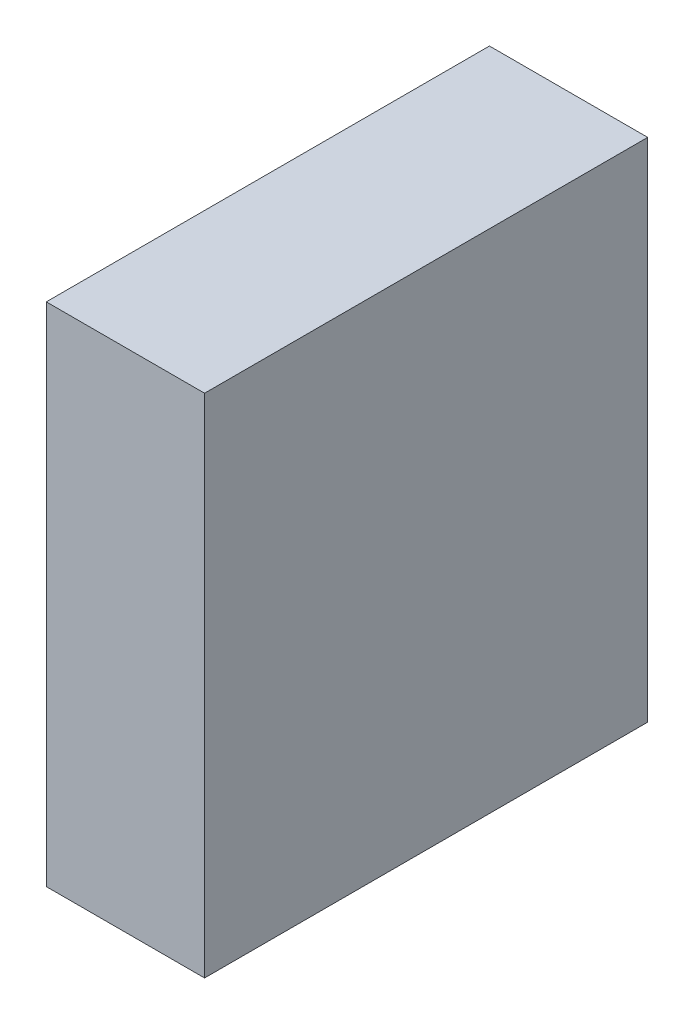
ISO-10303-21;
HEADER;
FILE_DESCRIPTION(('STEP AP214'),'2;1');
FILE_NAME('part.step','',(''),(''),'','','');
FILE_SCHEMA(('AUTOMOTIVE_DESIGN { 1 0 10303 214 1 1 1 1 }'));
ENDSEC;
DATA;
#1=APPLICATION_CONTEXT('core data for automotive mechanical design processes');
#2=APPLICATION_PROTOCOL_DEFINITION('international standard','automotive_design',2000,#1);
#3=PRODUCT_CONTEXT('',#1,'mechanical');
#4=PRODUCT('Part','Part','',(#3));
#5=PRODUCT_RELATED_PRODUCT_CATEGORY('part','',(#4));
#6=PRODUCT_DEFINITION_FORMATION('','',#4);
#7=PRODUCT_DEFINITION_CONTEXT('part definition',#1,'design');
#8=PRODUCT_DEFINITION('design','',#6,#7);
#9=PRODUCT_DEFINITION_SHAPE('','',#8);
#10=(LENGTH_UNIT() NAMED_UNIT(*) SI_UNIT(.MILLI.,.METRE.));
#11=(NAMED_UNIT(*) PLANE_ANGLE_UNIT() SI_UNIT($,.RADIAN.));
#12=(NAMED_UNIT(*) SI_UNIT($,.STERADIAN.) SOLID_ANGLE_UNIT());
#13=UNCERTAINTY_MEASURE_WITH_UNIT(LENGTH_MEASURE(1.E-05),#10,'distance_accuracy_value','');
#14=(GEOMETRIC_REPRESENTATION_CONTEXT(3) GLOBAL_UNCERTAINTY_ASSIGNED_CONTEXT((#13)) GLOBAL_UNIT_ASSIGNED_CONTEXT((#10,
#11,#12)) REPRESENTATION_CONTEXT('',''));
#15=CARTESIAN_POINT('',(0.,0.,0.));
#16=DIRECTION('',(0.,0.,1.));
#17=DIRECTION('',(1.,0.,0.));
#18=AXIS2_PLACEMENT_3D('',#15,#16,#17);
#19=CARTESIAN_POINT('',(1.25,-0.4,0.));
#20=DIRECTION('',(-1.,0.,0.));
#21=DIRECTION('',(0.,0.,1.));
#22=AXIS2_PLACEMENT_3D('',#19,#20,#21);
#23=PLANE('',#22);
#24=DIRECTION('',(0.,0.,1.));
#25=VECTOR('',#24,1.);
#26=CARTESIAN_POINT('',(1.25,0.4,0.));
#27=LINE('',#26,#25);
#28=CARTESIAN_POINT('',(1.25,0.4,0.));
#29=VERTEX_POINT('',#28);
#30=CARTESIAN_POINT('',(1.25,0.4,0.7));
#31=VERTEX_POINT('',#30);
#32=EDGE_CURVE('E20',#29,#31,#27,.T.);
#33=ORIENTED_EDGE('',*,*,#32,.F.);
#34=DIRECTION('',(0.,1.,0.));
#35=VECTOR('',#34,1.);
#36=CARTESIAN_POINT('',(1.25,0.,0.));
#37=LINE('',#36,#35);
#38=CARTESIAN_POINT('',(1.25,-0.4,0.));
#39=VERTEX_POINT('',#38);
#40=EDGE_CURVE('E79',#29,#39,#37,.F.);
#41=ORIENTED_EDGE('',*,*,#40,.T.);
#42=DIRECTION('',(0.,0.,-1.));
#43=VECTOR('',#42,1.);
#44=CARTESIAN_POINT('',(1.25,-0.4,0.));
#45=LINE('',#44,#43);
#46=CARTESIAN_POINT('',(1.25,-0.4,0.7));
#47=VERTEX_POINT('',#46);
#48=EDGE_CURVE('E61',#47,#39,#45,.T.);
#49=ORIENTED_EDGE('',*,*,#48,.F.);
#50=DIRECTION('',(0.,1.,0.));
#51=VECTOR('',#50,1.);
#52=CARTESIAN_POINT('',(1.25,0.,0.7));
#53=LINE('',#52,#51);
#54=EDGE_CURVE('E56',#31,#47,#53,.F.);
#55=ORIENTED_EDGE('',*,*,#54,.F.);
#56=EDGE_LOOP('',(#33,#41,#49,#55));
#57=FACE_BOUND('',#56,.T.);
#58=ADVANCED_FACE('F17',(#57),#23,.T.);
#59=CARTESIAN_POINT('',(1.25,0.4,0.));
#60=DIRECTION('',(0.,1.,0.));
#61=DIRECTION('',(0.,0.,1.));
#62=AXIS2_PLACEMENT_3D('',#59,#60,#61);
#63=PLANE('',#62);
#64=DIRECTION('',(0.,0.,-1.));
#65=VECTOR('',#64,1.);
#66=CARTESIAN_POINT('',(1.5,0.4,0.));
#67=LINE('',#66,#65);
#68=CARTESIAN_POINT('',(1.5,0.4,0.));
#69=VERTEX_POINT('',#68);
#70=CARTESIAN_POINT('',(1.5,0.4,0.7));
#71=VERTEX_POINT('',#70);
#72=EDGE_CURVE('E83',#69,#71,#67,.F.);
#73=ORIENTED_EDGE('',*,*,#72,.F.);
#74=DIRECTION('',(1.,0.,0.));
#75=VECTOR('',#74,1.);
#76=CARTESIAN_POINT('',(1.375,0.4,0.));
#77=LINE('',#76,#75);
#78=EDGE_CURVE('E68',#69,#29,#77,.F.);
#79=ORIENTED_EDGE('',*,*,#78,.T.);
#80=ORIENTED_EDGE('',*,*,#32,.T.);
#81=DIRECTION('',(1.,0.,0.));
#82=VECTOR('',#81,1.);
#83=CARTESIAN_POINT('',(1.375,0.4,0.7));
#84=LINE('',#83,#82);
#85=EDGE_CURVE('E63',#71,#31,#84,.F.);
#86=ORIENTED_EDGE('',*,*,#85,.F.);
#87=EDGE_LOOP('',(#73,#79,#80,#86));
#88=FACE_BOUND('',#87,.T.);
#89=ADVANCED_FACE('F65',(#88),#63,.T.);
#90=CARTESIAN_POINT('',(1.375,0.,0.7));
#91=DIRECTION('',(0.,0.,1.));
#92=DIRECTION('',(1.,0.,0.));
#93=AXIS2_PLACEMENT_3D('',#90,#91,#92);
#94=PLANE('',#93);
#95=DIRECTION('',(0.,1.,0.));
#96=VECTOR('',#95,1.);
#97=CARTESIAN_POINT('',(1.5,0.4,0.7));
#98=LINE('',#97,#96);
#99=CARTESIAN_POINT('',(1.5,-0.4,0.7));
#100=VERTEX_POINT('',#99);
#101=EDGE_CURVE('E72',#71,#100,#98,.F.);
#102=ORIENTED_EDGE('',*,*,#101,.F.);
#103=ORIENTED_EDGE('',*,*,#85,.T.);
#104=ORIENTED_EDGE('',*,*,#54,.T.);
#105=DIRECTION('',(1.,0.,0.));
#106=VECTOR('',#105,1.);
#107=CARTESIAN_POINT('',(1.5,-0.4,0.7));
#108=LINE('',#107,#106);
#109=EDGE_CURVE('E74',#100,#47,#108,.F.);
#110=ORIENTED_EDGE('',*,*,#109,.F.);
#111=EDGE_LOOP('',(#102,#103,#104,#110));
#112=FACE_BOUND('',#111,.T.);
#113=ADVANCED_FACE('F70',(#112),#94,.T.);
#114=CARTESIAN_POINT('',(1.5,-0.4,0.));
#115=DIRECTION('',(0.,-1.,0.));
#116=DIRECTION('',(0.,0.,-1.));
#117=AXIS2_PLACEMENT_3D('',#114,#115,#116);
#118=PLANE('',#117);
#119=ORIENTED_EDGE('',*,*,#48,.T.);
#120=DIRECTION('',(1.,0.,0.));
#121=VECTOR('',#120,1.);
#122=CARTESIAN_POINT('',(1.375,-0.4,0.));
#123=LINE('',#122,#121);
#124=CARTESIAN_POINT('',(1.5,-0.4,0.));
#125=VERTEX_POINT('',#124);
#126=EDGE_CURVE('E35',#39,#125,#123,.T.);
#127=ORIENTED_EDGE('',*,*,#126,.T.);
#128=DIRECTION('',(0.,0.,-1.));
#129=VECTOR('',#128,1.);
#130=CARTESIAN_POINT('',(1.5,-0.4,0.));
#131=LINE('',#130,#129);
#132=EDGE_CURVE('E26',#100,#125,#131,.T.);
#133=ORIENTED_EDGE('',*,*,#132,.F.);
#134=ORIENTED_EDGE('',*,*,#109,.T.);
#135=EDGE_LOOP('',(#119,#127,#133,#134));
#136=FACE_BOUND('',#135,.T.);
#137=ADVANCED_FACE('F89',(#136),#118,.T.);
#138=CARTESIAN_POINT('',(1.375,0.,0.));
#139=DIRECTION('',(0.,0.,1.));
#140=DIRECTION('',(1.,0.,0.));
#141=AXIS2_PLACEMENT_3D('',#138,#139,#140);
#142=PLANE('',#141);
#143=DIRECTION('',(0.,1.,0.));
#144=VECTOR('',#143,1.);
#145=CARTESIAN_POINT('',(1.5,0.4,0.));
#146=LINE('',#145,#144);
#147=EDGE_CURVE('E11',#125,#69,#146,.T.);
#148=ORIENTED_EDGE('',*,*,#147,.F.);
#149=ORIENTED_EDGE('',*,*,#126,.F.);
#150=ORIENTED_EDGE('',*,*,#40,.F.);
#151=ORIENTED_EDGE('',*,*,#78,.F.);
#152=EDGE_LOOP('',(#148,#149,#150,#151));
#153=FACE_BOUND('',#152,.T.);
#154=ADVANCED_FACE('F91',(#153),#142,.F.);
#155=CARTESIAN_POINT('',(1.5,0.4,0.));
#156=DIRECTION('',(1.,0.,0.));
#157=DIRECTION('',(0.,0.,-1.));
#158=AXIS2_PLACEMENT_3D('',#155,#156,#157);
#159=PLANE('',#158);
#160=ORIENTED_EDGE('',*,*,#132,.T.);
#161=ORIENTED_EDGE('',*,*,#147,.T.);
#162=ORIENTED_EDGE('',*,*,#72,.T.);
#163=ORIENTED_EDGE('',*,*,#101,.T.);
#164=EDGE_LOOP('',(#160,#161,#162,#163));
#165=FACE_BOUND('',#164,.T.);
#166=ADVANCED_FACE('F88',(#165),#159,.T.);
#167=CLOSED_SHELL('',(#58,#89,#113,#137,#154,#166));
#168=MANIFOLD_SOLID_BREP('B1',#167);
#169=ADVANCED_BREP_SHAPE_REPRESENTATION('',(#18,#168),#14);
#170=SHAPE_DEFINITION_REPRESENTATION(#9,#169);
ENDSEC;
END-ISO-10303-21;
